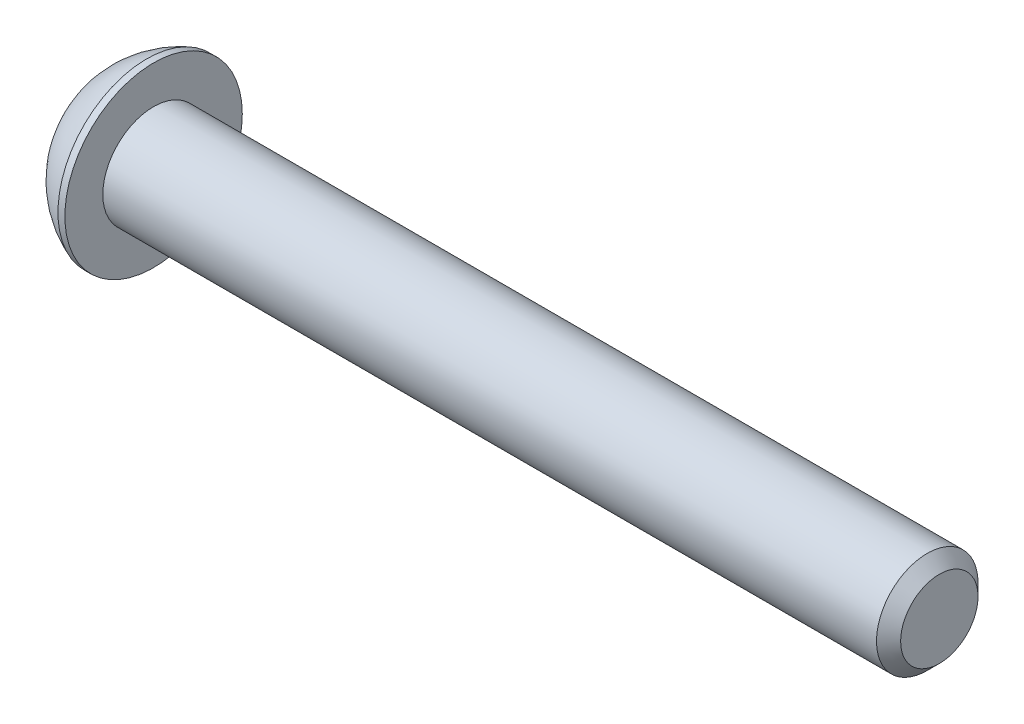
ISO-10303-21;
HEADER;
FILE_DESCRIPTION(('STEP AP214'),'2;1');
FILE_NAME('part.step','',(''),(''),'','','');
FILE_SCHEMA(('AUTOMOTIVE_DESIGN { 1 0 10303 214 1 1 1 1 }'));
ENDSEC;
DATA;
#1=APPLICATION_CONTEXT('core data for automotive mechanical design processes');
#2=APPLICATION_PROTOCOL_DEFINITION('international standard','automotive_design',2000,#1);
#3=PRODUCT_CONTEXT('',#1,'mechanical');
#4=PRODUCT('Part','Part','',(#3));
#5=PRODUCT_RELATED_PRODUCT_CATEGORY('part','',(#4));
#6=PRODUCT_DEFINITION_FORMATION('','',#4);
#7=PRODUCT_DEFINITION_CONTEXT('part definition',#1,'design');
#8=PRODUCT_DEFINITION('design','',#6,#7);
#9=PRODUCT_DEFINITION_SHAPE('','',#8);
#10=(LENGTH_UNIT() NAMED_UNIT(*) SI_UNIT(.MILLI.,.METRE.));
#11=(NAMED_UNIT(*) PLANE_ANGLE_UNIT() SI_UNIT($,.RADIAN.));
#12=(NAMED_UNIT(*) SI_UNIT($,.STERADIAN.) SOLID_ANGLE_UNIT());
#13=UNCERTAINTY_MEASURE_WITH_UNIT(LENGTH_MEASURE(1.E-05),#10,'distance_accuracy_value','');
#14=(GEOMETRIC_REPRESENTATION_CONTEXT(3) GLOBAL_UNCERTAINTY_ASSIGNED_CONTEXT((#13)) GLOBAL_UNIT_ASSIGNED_CONTEXT((#10,
#11,#12)) REPRESENTATION_CONTEXT('',''));
#15=CARTESIAN_POINT('',(0.,0.,0.));
#16=DIRECTION('',(0.,0.,1.));
#17=DIRECTION('',(1.,0.,0.));
#18=AXIS2_PLACEMENT_3D('',#15,#16,#17);
#19=CARTESIAN_POINT('',(1.64730562793069,0.,0.));
#20=DIRECTION('',(1.,0.,0.));
#21=DIRECTION('',(0.,0.,-1.));
#22=AXIS2_PLACEMENT_3D('',#19,#20,#21);
#23=DEGENERATE_TOROIDAL_SURFACE('',#22,0.00892436136860583,5.91819999999996,.T.);
#24=CARTESIAN_POINT('',(-3.3528,0.,0.));
#25=DIRECTION('',(1.,0.,0.));
#26=DIRECTION('',(0.,0.,-1.));
#27=AXIS2_PLACEMENT_3D('',#24,#25,#26);
#28=CIRCLE('',#27,3.17500000000002);
#29=CARTESIAN_POINT('',(-3.3528,0.,-3.17500000000002));
#30=VERTEX_POINT('',#29);
#31=EDGE_CURVE('E151',#30,#30,#28,.T.);
#32=ORIENTED_EDGE('',*,*,#31,.T.);
#33=EDGE_LOOP('',(#32));
#34=FACE_BOUND('',#33,.T.);
#35=CARTESIAN_POINT('',(-0.4318,0.,0.));
#36=DIRECTION('',(1.,0.,0.));
#37=DIRECTION('',(0.,0.,-1.));
#38=AXIS2_PLACEMENT_3D('',#35,#36,#37);
#39=CIRCLE('',#38,5.5499);
#40=CARTESIAN_POINT('',(-0.4318,0.,-5.5499));
#41=VERTEX_POINT('',#40);
#42=EDGE_CURVE('E145',#41,#41,#39,.T.);
#43=ORIENTED_EDGE('',*,*,#42,.F.);
#44=EDGE_LOOP('',(#43));
#45=FACE_BOUND('',#44,.T.);
#46=ADVANCED_FACE('F35',(#34,#45),#23,.T.);
#47=CARTESIAN_POINT('',(-3.3528,3.17500000000002,0.));
#48=DIRECTION('',(-1.,0.,0.));
#49=DIRECTION('',(0.,0.,1.));
#50=AXIS2_PLACEMENT_3D('',#47,#48,#49);
#51=PLANE('',#50);
#52=DIRECTION('',(0.,0.866025403784439,0.5));
#53=VECTOR('',#52,1.);
#54=CARTESIAN_POINT('',(-3.3528,-1.984375,1.14567944042316));
#55=LINE('',#54,#53);
#56=CARTESIAN_POINT('',(-3.3528,-1.984375,1.14567944042316));
#57=VERTEX_POINT('',#56);
#58=CARTESIAN_POINT('',(-3.3528,0.,2.29135888084633));
#59=VERTEX_POINT('',#58);
#60=EDGE_CURVE('E50',#57,#59,#55,.T.);
#61=ORIENTED_EDGE('',*,*,#60,.F.);
#62=DIRECTION('',(0.,0.,1.));
#63=VECTOR('',#62,1.);
#64=CARTESIAN_POINT('',(-3.3528,-1.984375,-1.14567944042316));
#65=LINE('',#64,#63);
#66=CARTESIAN_POINT('',(-3.3528,-1.984375,-1.14567944042316));
#67=VERTEX_POINT('',#66);
#68=EDGE_CURVE('E133',#67,#57,#65,.T.);
#69=ORIENTED_EDGE('',*,*,#68,.F.);
#70=DIRECTION('',(0.,-0.866025403784439,0.5));
#71=VECTOR('',#70,1.);
#72=CARTESIAN_POINT('',(-3.3528,0.,-2.29135888084633));
#73=LINE('',#72,#71);
#74=CARTESIAN_POINT('',(-3.3528,0.,-2.29135888084633));
#75=VERTEX_POINT('',#74);
#76=EDGE_CURVE('E131',#75,#67,#73,.T.);
#77=ORIENTED_EDGE('',*,*,#76,.F.);
#78=DIRECTION('',(0.,-0.866025403784439,-0.5));
#79=VECTOR('',#78,1.);
#80=CARTESIAN_POINT('',(-3.3528,1.984375,-1.14567944042316));
#81=LINE('',#80,#79);
#82=CARTESIAN_POINT('',(-3.3528,1.984375,-1.14567944042316));
#83=VERTEX_POINT('',#82);
#84=EDGE_CURVE('E98',#83,#75,#81,.T.);
#85=ORIENTED_EDGE('',*,*,#84,.F.);
#86=DIRECTION('',(0.,0.,-1.));
#87=VECTOR('',#86,1.);
#88=CARTESIAN_POINT('',(-3.3528,1.984375,1.14567944042316));
#89=LINE('',#88,#87);
#90=CARTESIAN_POINT('',(-3.3528,1.984375,1.14567944042316));
#91=VERTEX_POINT('',#90);
#92=EDGE_CURVE('E127',#91,#83,#89,.T.);
#93=ORIENTED_EDGE('',*,*,#92,.F.);
#94=DIRECTION('',(0.,0.866025403784439,-0.5));
#95=VECTOR('',#94,1.);
#96=CARTESIAN_POINT('',(-3.3528,0.,2.29135888084633));
#97=LINE('',#96,#95);
#98=EDGE_CURVE('E124',#59,#91,#97,.T.);
#99=ORIENTED_EDGE('',*,*,#98,.F.);
#100=EDGE_LOOP('',(#61,#69,#77,#85,#93,#99));
#101=FACE_BOUND('',#100,.T.);
#102=ORIENTED_EDGE('',*,*,#31,.F.);
#103=EDGE_LOOP('',(#102));
#104=FACE_BOUND('',#103,.T.);
#105=ADVANCED_FACE('F167',(#101,#104),#51,.T.);
#106=CARTESIAN_POINT('',(0.,0.,0.));
#107=DIRECTION('',(1.,0.,0.));
#108=DIRECTION('',(0.,0.,-1.));
#109=AXIS2_PLACEMENT_3D('',#106,#107,#108);
#110=PLANE('',#109);
#111=CARTESIAN_POINT('',(0.,0.,0.));
#112=DIRECTION('',(1.,0.,0.));
#113=DIRECTION('',(0.,0.,-1.));
#114=AXIS2_PLACEMENT_3D('',#111,#112,#113);
#115=CIRCLE('',#114,3.175);
#116=CARTESIAN_POINT('',(0.,0.,3.175));
#117=VERTEX_POINT('',#116);
#118=EDGE_CURVE('E137',#117,#117,#115,.T.);
#119=ORIENTED_EDGE('',*,*,#118,.F.);
#120=EDGE_LOOP('',(#119));
#121=FACE_BOUND('',#120,.T.);
#122=CARTESIAN_POINT('',(0.,0.,0.));
#123=DIRECTION('',(1.,0.,0.));
#124=DIRECTION('',(0.,0.,-1.));
#125=AXIS2_PLACEMENT_3D('',#122,#123,#124);
#126=CIRCLE('',#125,5.5499);
#127=CARTESIAN_POINT('',(0.,0.,-5.5499));
#128=VERTEX_POINT('',#127);
#129=EDGE_CURVE('E148',#128,#128,#126,.T.);
#130=ORIENTED_EDGE('',*,*,#129,.T.);
#131=EDGE_LOOP('',(#130));
#132=FACE_BOUND('',#131,.T.);
#133=ADVANCED_FACE('F172',(#121,#132),#110,.T.);
#134=CARTESIAN_POINT('',(-3.3528,0.,0.));
#135=DIRECTION('',(1.,0.,0.));
#136=DIRECTION('',(0.,0.,-1.));
#137=AXIS2_PLACEMENT_3D('',#134,#135,#136);
#138=CYLINDRICAL_SURFACE('',#137,5.5499);
#139=ORIENTED_EDGE('',*,*,#42,.T.);
#140=EDGE_LOOP('',(#139));
#141=FACE_BOUND('',#140,.T.);
#142=ORIENTED_EDGE('',*,*,#129,.F.);
#143=EDGE_LOOP('',(#142));
#144=FACE_BOUND('',#143,.T.);
#145=ADVANCED_FACE('F179',(#141,#144),#138,.T.);
#146=CARTESIAN_POINT('',(49.149,0.,0.));
#147=DIRECTION('',(-1.,0.,0.));
#148=DIRECTION('',(0.,0.,1.));
#149=AXIS2_PLACEMENT_3D('',#146,#147,#148);
#150=CYLINDRICAL_SURFACE('',#149,3.175);
#151=CARTESIAN_POINT('',(48.3933499999865,0.,0.));
#152=DIRECTION('',(1.,0.,0.));
#153=DIRECTION('',(0.,0.,-1.));
#154=AXIS2_PLACEMENT_3D('',#151,#152,#153);
#155=CIRCLE('',#154,3.175);
#156=CARTESIAN_POINT('',(48.3933499999865,0.,3.175));
#157=VERTEX_POINT('',#156);
#158=EDGE_CURVE('E11',#157,#157,#155,.F.);
#159=CARTESIAN_POINT('',(48.3933499999865,0.,3.175));
#160=CARTESIAN_POINT('',(47.8892526041533,0.,3.175));
#161=CARTESIAN_POINT('',(47.3851552083201,0.,3.175));
#162=CARTESIAN_POINT('',(46.3769604166538,0.,3.175));
#163=CARTESIAN_POINT('',(45.8728630208206,0.,3.175));
#164=CARTESIAN_POINT('',(44.8646682291542,0.,3.175));
#165=CARTESIAN_POINT('',(44.360570833321,0.,3.175));
#166=CARTESIAN_POINT('',(43.3523760416546,0.,3.175));
#167=CARTESIAN_POINT('',(42.8482786458214,0.,3.175));
#168=CARTESIAN_POINT('',(41.840083854155,0.,3.175));
#169=CARTESIAN_POINT('',(41.3359864583218,0.,3.175));
#170=CARTESIAN_POINT('',(40.3277916666555,0.,3.175));
#171=CARTESIAN_POINT('',(39.8236942708223,0.,3.175));
#172=CARTESIAN_POINT('',(38.8154994791559,0.,3.175));
#173=CARTESIAN_POINT('',(38.3114020833227,0.,3.175));
#174=CARTESIAN_POINT('',(37.3032072916563,0.,3.175));
#175=CARTESIAN_POINT('',(36.7991098958231,0.,3.175));
#176=CARTESIAN_POINT('',(35.7909151041567,0.,3.175));
#177=CARTESIAN_POINT('',(35.2868177083235,0.,3.175));
#178=CARTESIAN_POINT('',(34.2786229166571,0.,3.175));
#179=CARTESIAN_POINT('',(33.7745255208239,0.,3.175));
#180=CARTESIAN_POINT('',(32.7663307291576,0.,3.175));
#181=CARTESIAN_POINT('',(32.2622333333244,0.,3.175));
#182=CARTESIAN_POINT('',(31.254038541658,0.,3.175));
#183=CARTESIAN_POINT('',(30.7499411458248,0.,3.175));
#184=CARTESIAN_POINT('',(29.7417463541584,0.,3.175));
#185=CARTESIAN_POINT('',(29.2376489583252,0.,3.175));
#186=CARTESIAN_POINT('',(28.2294541666588,0.,3.175));
#187=CARTESIAN_POINT('',(27.7253567708256,0.,3.175));
#188=CARTESIAN_POINT('',(26.7171619791592,0.,3.175));
#189=CARTESIAN_POINT('',(26.213064583326,0.,3.175));
#190=CARTESIAN_POINT('',(25.2048697916597,0.,3.175));
#191=CARTESIAN_POINT('',(24.7007723958265,0.,3.175));
#192=CARTESIAN_POINT('',(23.6925776041601,0.,3.175));
#193=CARTESIAN_POINT('',(23.1884802083269,0.,3.175));
#194=CARTESIAN_POINT('',(22.1802854166605,0.,3.175));
#195=CARTESIAN_POINT('',(21.6761880208273,0.,3.175));
#196=CARTESIAN_POINT('',(20.6679932291609,0.,3.175));
#197=CARTESIAN_POINT('',(20.1638958333277,0.,3.175));
#198=CARTESIAN_POINT('',(19.1557010416613,0.,3.175));
#199=CARTESIAN_POINT('',(18.6516036458281,0.,3.175));
#200=CARTESIAN_POINT('',(17.6434088541618,0.,3.175));
#201=CARTESIAN_POINT('',(17.1393114583286,0.,3.175));
#202=CARTESIAN_POINT('',(16.1311166666622,0.,3.175));
#203=CARTESIAN_POINT('',(15.627019270829,0.,3.175));
#204=CARTESIAN_POINT('',(14.6188244791626,0.,3.175));
#205=CARTESIAN_POINT('',(14.1147270833294,0.,3.175));
#206=CARTESIAN_POINT('',(13.106532291663,0.,3.175));
#207=CARTESIAN_POINT('',(12.6024348958298,0.,3.175));
#208=CARTESIAN_POINT('',(11.5942401041634,0.,3.175));
#209=CARTESIAN_POINT('',(11.0901427083302,0.,3.175));
#210=CARTESIAN_POINT('',(10.0819479166639,0.,3.175));
#211=CARTESIAN_POINT('',(9.57785052083066,0.,3.175));
#212=CARTESIAN_POINT('',(8.56965572916427,0.,3.175));
#213=CARTESIAN_POINT('',(8.06555833333108,0.,3.175));
#214=CARTESIAN_POINT('',(7.0573635416647,0.,3.175));
#215=CARTESIAN_POINT('',(6.55326614583151,0.,3.175));
#216=CARTESIAN_POINT('',(5.54507135416512,0.,3.175));
#217=CARTESIAN_POINT('',(5.04097395833193,0.,3.175));
#218=CARTESIAN_POINT('',(4.03277916666554,0.,3.175));
#219=CARTESIAN_POINT('',(3.52868177083235,0.,3.175));
#220=CARTESIAN_POINT('',(2.52048697916596,0.,3.175));
#221=CARTESIAN_POINT('',(2.01638958333276,0.,3.175));
#222=CARTESIAN_POINT('',(1.00819479166638,0.,3.175));
#223=CARTESIAN_POINT('',(0.504097395833184,0.,3.175));
#224=CARTESIAN_POINT('',(0.,0.,3.175));
#225=B_SPLINE_CURVE_WITH_KNOTS('',3,(#159,#160,#161,#162,#163,#164,#165,#166,#167,#168,#169,
#170,#171,#172,#173,#174,#175,#176,#177,#178,#179,#180,#181,#182,#183,#184,#185,#186,#187,#188,
#189,#190,#191,#192,#193,#194,#195,#196,#197,#198,#199,#200,#201,#202,#203,#204,#205,#206,#207,
#208,#209,#210,#211,#212,#213,#214,#215,#216,#217,#218,#219,#220,#221,#222,#223,#224),
.UNSPECIFIED.,.F.,.F.,(4,2,2,2,2,2,2,2,2,2,2,2,2,2,2,2,2,2,2,2,2,2,2,2,2,2,2,2,2,2,2,2,4),(0.,
1.51229218749958,3.02458437499915,4.53687656249874,6.04916874999831,7.56146093749789,
9.07375312499747,10.5860453124971,12.0983374999966,13.6106296874962,15.1229218749958,
16.6352140624954,18.1475062499949,19.6597984374945,21.1720906249941,22.6843828124937,
24.1966749999933,25.7089671874928,27.2212593749924,28.733551562492,30.2458437499916,
31.7581359374912,33.2704281249907,34.7827203124903,36.2950124999899,37.8073046874895,
39.3195968749891,40.8318890624886,42.3441812499882,43.8564734374878,45.3687656249874,
46.881057812487,48.3933499999865),.UNSPECIFIED.);
#226=EDGE_CURVE('BSEAM183',#157,#117,#225,.T.);
#227=ORIENTED_EDGE('',*,*,#158,.T.);
#228=ORIENTED_EDGE('',*,*,#118,.T.);
#229=ORIENTED_EDGE('',*,*,#226,.T.);
#230=ORIENTED_EDGE('',*,*,#226,.F.);
#231=EDGE_LOOP('',(#227,#229,#228,#230));
#232=FACE_BOUND('',#231,.T.);
#233=ADVANCED_FACE('F183',(#232),#150,.T.);
#234=CARTESIAN_POINT('',(49.149,0.,0.));
#235=DIRECTION('',(1.,0.,0.));
#236=DIRECTION('',(0.,0.,-1.));
#237=AXIS2_PLACEMENT_3D('',#234,#235,#236);
#238=PLANE('',#237);
#239=CARTESIAN_POINT('',(49.149,0.,0.));
#240=DIRECTION('',(1.,0.,0.));
#241=DIRECTION('',(0.,0.,-1.));
#242=AXIS2_PLACEMENT_3D('',#239,#240,#241);
#243=CIRCLE('',#242,2.41934999998654);
#244=CARTESIAN_POINT('',(49.149,0.,-2.41934999998654));
#245=VERTEX_POINT('',#244);
#246=EDGE_CURVE('E43',#245,#245,#243,.T.);
#247=ORIENTED_EDGE('',*,*,#246,.T.);
#248=EDGE_LOOP('',(#247));
#249=FACE_BOUND('',#248,.T.);
#250=ADVANCED_FACE('F156',(#249),#238,.T.);
#251=CARTESIAN_POINT('',(-1.1303,-1.984375,1.14567944042316));
#252=DIRECTION('',(0.,-0.5,0.866025403784439));
#253=DIRECTION('',(0.,-0.866025403784439,-0.5));
#254=AXIS2_PLACEMENT_3D('',#251,#252,#253);
#255=PLANE('',#254);
#256=ORIENTED_EDGE('',*,*,#60,.T.);
#257=DIRECTION('',(-1.,0.,0.));
#258=VECTOR('',#257,1.);
#259=CARTESIAN_POINT('',(-1.1303,0.,2.29135888084633));
#260=LINE('',#259,#258);
#261=CARTESIAN_POINT('',(-1.1303,0.,2.29135888084633));
#262=VERTEX_POINT('',#261);
#263=EDGE_CURVE('E80',#262,#59,#260,.T.);
#264=ORIENTED_EDGE('',*,*,#263,.F.);
#265=DIRECTION('',(0.,0.866025403784439,0.5));
#266=VECTOR('',#265,1.);
#267=CARTESIAN_POINT('',(-1.1303,-1.984375,1.14567944042316));
#268=LINE('',#267,#266);
#269=CARTESIAN_POINT('',(-1.1303,-1.984375,1.14567944042316));
#270=VERTEX_POINT('',#269);
#271=EDGE_CURVE('E135',#270,#262,#268,.T.);
#272=ORIENTED_EDGE('',*,*,#271,.F.);
#273=DIRECTION('',(-1.,0.,0.));
#274=VECTOR('',#273,1.);
#275=CARTESIAN_POINT('',(-1.1303,-1.984375,1.14567944042316));
#276=LINE('',#275,#274);
#277=EDGE_CURVE('E58',#270,#57,#276,.T.);
#278=ORIENTED_EDGE('',*,*,#277,.T.);
#279=EDGE_LOOP('',(#256,#264,#272,#278));
#280=FACE_BOUND('',#279,.T.);
#281=ADVANCED_FACE('F190',(#280),#255,.F.);
#282=CARTESIAN_POINT('',(-1.1303,-1.984375,-1.14567944042316));
#283=DIRECTION('',(0.,-1.,0.));
#284=DIRECTION('',(0.,0.,-1.));
#285=AXIS2_PLACEMENT_3D('',#282,#283,#284);
#286=PLANE('',#285);
#287=ORIENTED_EDGE('',*,*,#68,.T.);
#288=ORIENTED_EDGE('',*,*,#277,.F.);
#289=DIRECTION('',(0.,0.,1.));
#290=VECTOR('',#289,1.);
#291=CARTESIAN_POINT('',(-1.1303,-1.984375,-1.14567944042316));
#292=LINE('',#291,#290);
#293=CARTESIAN_POINT('',(-1.1303,-1.984375,-1.14567944042316));
#294=VERTEX_POINT('',#293);
#295=EDGE_CURVE('E110',#294,#270,#292,.T.);
#296=ORIENTED_EDGE('',*,*,#295,.F.);
#297=DIRECTION('',(-1.,0.,0.));
#298=VECTOR('',#297,1.);
#299=CARTESIAN_POINT('',(-1.1303,-1.984375,-1.14567944042316));
#300=LINE('',#299,#298);
#301=EDGE_CURVE('E102',#294,#67,#300,.T.);
#302=ORIENTED_EDGE('',*,*,#301,.T.);
#303=EDGE_LOOP('',(#287,#288,#296,#302));
#304=FACE_BOUND('',#303,.T.);
#305=ADVANCED_FACE('F193',(#304),#286,.F.);
#306=CARTESIAN_POINT('',(-1.1303,0.,-2.29135888084633));
#307=DIRECTION('',(0.,-0.5,-0.866025403784439));
#308=DIRECTION('',(0.,0.866025403784439,-0.5));
#309=AXIS2_PLACEMENT_3D('',#306,#307,#308);
#310=PLANE('',#309);
#311=ORIENTED_EDGE('',*,*,#76,.T.);
#312=ORIENTED_EDGE('',*,*,#301,.F.);
#313=DIRECTION('',(0.,-0.866025403784439,0.5));
#314=VECTOR('',#313,1.);
#315=CARTESIAN_POINT('',(-1.1303,0.,-2.29135888084633));
#316=LINE('',#315,#314);
#317=CARTESIAN_POINT('',(-1.1303,0.,-2.29135888084633));
#318=VERTEX_POINT('',#317);
#319=EDGE_CURVE('E106',#318,#294,#316,.T.);
#320=ORIENTED_EDGE('',*,*,#319,.F.);
#321=DIRECTION('',(-1.,0.,0.));
#322=VECTOR('',#321,1.);
#323=CARTESIAN_POINT('',(-1.1303,0.,-2.29135888084633));
#324=LINE('',#323,#322);
#325=EDGE_CURVE('E91',#318,#75,#324,.T.);
#326=ORIENTED_EDGE('',*,*,#325,.T.);
#327=EDGE_LOOP('',(#311,#312,#320,#326));
#328=FACE_BOUND('',#327,.T.);
#329=ADVANCED_FACE('F107',(#328),#310,.F.);
#330=CARTESIAN_POINT('',(-1.1303,1.984375,-1.14567944042316));
#331=DIRECTION('',(0.,0.5,-0.866025403784439));
#332=DIRECTION('',(0.,0.866025403784439,0.5));
#333=AXIS2_PLACEMENT_3D('',#330,#331,#332);
#334=PLANE('',#333);
#335=ORIENTED_EDGE('',*,*,#84,.T.);
#336=ORIENTED_EDGE('',*,*,#325,.F.);
#337=DIRECTION('',(0.,-0.866025403784439,-0.5));
#338=VECTOR('',#337,1.);
#339=CARTESIAN_POINT('',(-1.1303,1.984375,-1.14567944042316));
#340=LINE('',#339,#338);
#341=CARTESIAN_POINT('',(-1.1303,1.984375,-1.14567944042316));
#342=VERTEX_POINT('',#341);
#343=EDGE_CURVE('E95',#342,#318,#340,.T.);
#344=ORIENTED_EDGE('',*,*,#343,.F.);
#345=DIRECTION('',(-1.,0.,0.));
#346=VECTOR('',#345,1.);
#347=CARTESIAN_POINT('',(-1.1303,1.984375,-1.14567944042316));
#348=LINE('',#347,#346);
#349=EDGE_CURVE('E103',#342,#83,#348,.T.);
#350=ORIENTED_EDGE('',*,*,#349,.T.);
#351=EDGE_LOOP('',(#335,#336,#344,#350));
#352=FACE_BOUND('',#351,.T.);
#353=ADVANCED_FACE('F93',(#352),#334,.F.);
#354=CARTESIAN_POINT('',(-1.1303,1.984375,1.14567944042316));
#355=DIRECTION('',(0.,1.,0.));
#356=DIRECTION('',(0.,0.,1.));
#357=AXIS2_PLACEMENT_3D('',#354,#355,#356);
#358=PLANE('',#357);
#359=ORIENTED_EDGE('',*,*,#92,.T.);
#360=ORIENTED_EDGE('',*,*,#349,.F.);
#361=DIRECTION('',(0.,0.,-1.));
#362=VECTOR('',#361,1.);
#363=CARTESIAN_POINT('',(-1.1303,1.984375,1.14567944042316));
#364=LINE('',#363,#362);
#365=CARTESIAN_POINT('',(-1.1303,1.984375,1.14567944042316));
#366=VERTEX_POINT('',#365);
#367=EDGE_CURVE('E116',#366,#342,#364,.T.);
#368=ORIENTED_EDGE('',*,*,#367,.F.);
#369=DIRECTION('',(-1.,0.,0.));
#370=VECTOR('',#369,1.);
#371=CARTESIAN_POINT('',(-1.1303,1.984375,1.14567944042316));
#372=LINE('',#371,#370);
#373=EDGE_CURVE('E140',#366,#91,#372,.T.);
#374=ORIENTED_EDGE('',*,*,#373,.T.);
#375=EDGE_LOOP('',(#359,#360,#368,#374));
#376=FACE_BOUND('',#375,.T.);
#377=ADVANCED_FACE('F196',(#376),#358,.F.);
#378=CARTESIAN_POINT('',(-1.1303,0.,2.29135888084633));
#379=DIRECTION('',(0.,0.5,0.866025403784439));
#380=DIRECTION('',(0.,-0.866025403784439,0.5));
#381=AXIS2_PLACEMENT_3D('',#378,#379,#380);
#382=PLANE('',#381);
#383=ORIENTED_EDGE('',*,*,#98,.T.);
#384=ORIENTED_EDGE('',*,*,#373,.F.);
#385=DIRECTION('',(0.,0.866025403784439,-0.5));
#386=VECTOR('',#385,1.);
#387=CARTESIAN_POINT('',(-1.1303,0.,2.29135888084633));
#388=LINE('',#387,#386);
#389=EDGE_CURVE('E118',#262,#366,#388,.T.);
#390=ORIENTED_EDGE('',*,*,#389,.F.);
#391=ORIENTED_EDGE('',*,*,#263,.T.);
#392=EDGE_LOOP('',(#383,#384,#390,#391));
#393=FACE_BOUND('',#392,.T.);
#394=ADVANCED_FACE('F163',(#393),#382,.F.);
#395=CARTESIAN_POINT('',(-1.1303,0.,0.));
#396=DIRECTION('',(-1.,0.,0.));
#397=DIRECTION('',(0.,0.,1.));
#398=AXIS2_PLACEMENT_3D('',#395,#396,#397);
#399=PLANE('',#398);
#400=ORIENTED_EDGE('',*,*,#271,.T.);
#401=ORIENTED_EDGE('',*,*,#389,.T.);
#402=ORIENTED_EDGE('',*,*,#367,.T.);
#403=ORIENTED_EDGE('',*,*,#343,.T.);
#404=ORIENTED_EDGE('',*,*,#319,.T.);
#405=ORIENTED_EDGE('',*,*,#295,.T.);
#406=EDGE_LOOP('',(#400,#401,#402,#403,#404,#405));
#407=FACE_BOUND('',#406,.T.);
#408=ADVANCED_FACE('F113',(#407),#399,.T.);
#409=CARTESIAN_POINT('',(49.149,0.,0.));
#410=DIRECTION('',(-1.,0.,0.));
#411=DIRECTION('',(0.,0.,1.));
#412=AXIS2_PLACEMENT_3D('',#409,#410,#411);
#413=CONICAL_SURFACE('',#412,2.41934999998654,0.78539816339745);
#414=ORIENTED_EDGE('',*,*,#158,.F.);
#415=EDGE_LOOP('',(#414));
#416=FACE_BOUND('',#415,.T.);
#417=ORIENTED_EDGE('',*,*,#246,.F.);
#418=EDGE_LOOP('',(#417));
#419=FACE_BOUND('',#418,.T.);
#420=ADVANCED_FACE('F37',(#416,#419),#413,.T.);
#421=CLOSED_SHELL('',(#46,#105,#133,#145,#233,#250,#281,#305,#329,#353,#377,#394,#408,#420));
#422=MANIFOLD_SOLID_BREP('B2',#421);
#423=ADVANCED_BREP_SHAPE_REPRESENTATION('',(#18,#422),#14);
#424=SHAPE_DEFINITION_REPRESENTATION(#9,#423);
ENDSEC;
END-ISO-10303-21;
